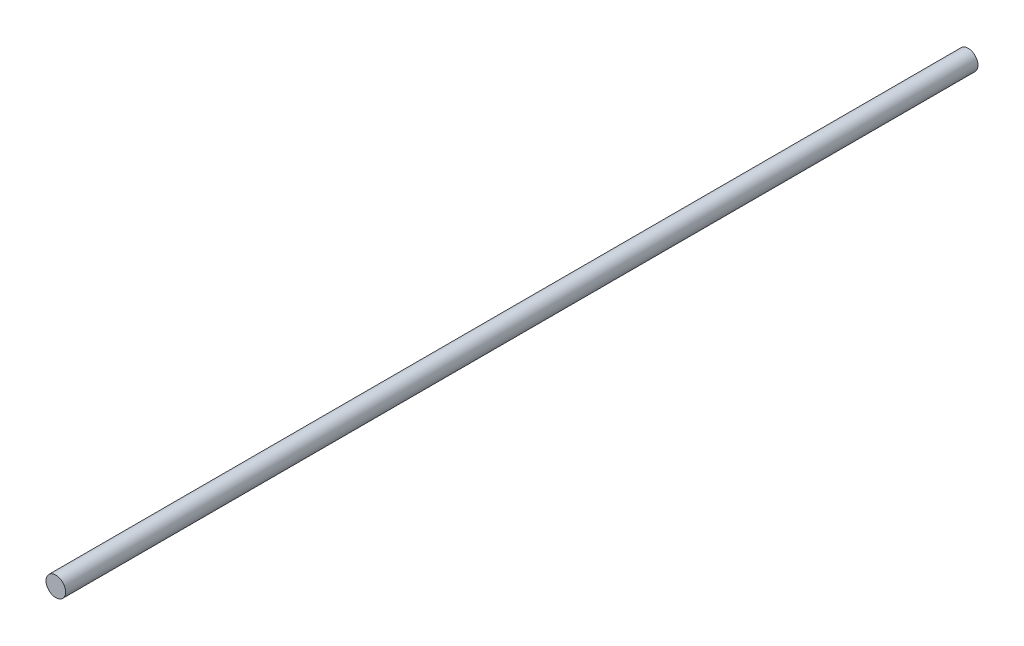
ISO-10303-21;
HEADER;
FILE_DESCRIPTION(('STEP AP214'),'2;1');
FILE_NAME('part.step','',(''),(''),'','','');
FILE_SCHEMA(('AUTOMOTIVE_DESIGN { 1 0 10303 214 1 1 1 1 }'));
ENDSEC;
DATA;
#1=APPLICATION_CONTEXT('core data for automotive mechanical design processes');
#2=APPLICATION_PROTOCOL_DEFINITION('international standard','automotive_design',2000,#1);
#3=PRODUCT_CONTEXT('',#1,'mechanical');
#4=PRODUCT('Part','Part','',(#3));
#5=PRODUCT_RELATED_PRODUCT_CATEGORY('part','',(#4));
#6=PRODUCT_DEFINITION_FORMATION('','',#4);
#7=PRODUCT_DEFINITION_CONTEXT('part definition',#1,'design');
#8=PRODUCT_DEFINITION('design','',#6,#7);
#9=PRODUCT_DEFINITION_SHAPE('','',#8);
#10=(LENGTH_UNIT() NAMED_UNIT(*) SI_UNIT(.MILLI.,.METRE.));
#11=(NAMED_UNIT(*) PLANE_ANGLE_UNIT() SI_UNIT($,.RADIAN.));
#12=(NAMED_UNIT(*) SI_UNIT($,.STERADIAN.) SOLID_ANGLE_UNIT());
#13=UNCERTAINTY_MEASURE_WITH_UNIT(LENGTH_MEASURE(1.E-05),#10,'distance_accuracy_value','');
#14=(GEOMETRIC_REPRESENTATION_CONTEXT(3) GLOBAL_UNCERTAINTY_ASSIGNED_CONTEXT((#13)) GLOBAL_UNIT_ASSIGNED_CONTEXT((#10,
#11,#12)) REPRESENTATION_CONTEXT('',''));
#15=CARTESIAN_POINT('',(0.,0.,0.));
#16=DIRECTION('',(0.,0.,1.));
#17=DIRECTION('',(1.,0.,0.));
#18=AXIS2_PLACEMENT_3D('',#15,#16,#17);
#19=CARTESIAN_POINT('',(0.,0.,590.3));
#20=DIRECTION('',(0.,0.,-1.));
#21=DIRECTION('',(-1.,0.,0.));
#22=AXIS2_PLACEMENT_3D('',#19,#20,#21);
#23=CYLINDRICAL_SURFACE('',#22,6.35);
#24=CARTESIAN_POINT('',(0.,0.,590.3));
#25=DIRECTION('',(0.,0.,1.));
#26=DIRECTION('',(1.,0.,0.));
#27=AXIS2_PLACEMENT_3D('',#24,#25,#26);
#28=CIRCLE('',#27,6.35);
#29=CARTESIAN_POINT('',(6.35,0.,590.3));
#30=VERTEX_POINT('',#29);
#31=EDGE_CURVE('E10',#30,#30,#28,.T.);
#32=ORIENTED_EDGE('',*,*,#31,.F.);
#33=EDGE_LOOP('',(#32));
#34=FACE_BOUND('',#33,.T.);
#35=CARTESIAN_POINT('',(0.,0.,0.));
#36=DIRECTION('',(0.,0.,1.));
#37=DIRECTION('',(1.,0.,0.));
#38=AXIS2_PLACEMENT_3D('',#35,#36,#37);
#39=CIRCLE('',#38,6.35);
#40=CARTESIAN_POINT('',(6.35,0.,0.));
#41=VERTEX_POINT('',#40);
#42=EDGE_CURVE('E42',#41,#41,#39,.T.);
#43=ORIENTED_EDGE('',*,*,#42,.T.);
#44=EDGE_LOOP('',(#43));
#45=FACE_BOUND('',#44,.T.);
#46=ADVANCED_FACE('F39',(#34,#45),#23,.T.);
#47=CARTESIAN_POINT('',(0.,0.,590.3));
#48=DIRECTION('',(0.,0.,1.));
#49=DIRECTION('',(1.,0.,0.));
#50=AXIS2_PLACEMENT_3D('',#47,#48,#49);
#51=PLANE('',#50);
#52=ORIENTED_EDGE('',*,*,#31,.T.);
#53=EDGE_LOOP('',(#52));
#54=FACE_BOUND('',#53,.T.);
#55=ADVANCED_FACE('F54',(#54),#51,.T.);
#56=CARTESIAN_POINT('',(0.,0.,0.));
#57=DIRECTION('',(0.,0.,1.));
#58=DIRECTION('',(1.,0.,0.));
#59=AXIS2_PLACEMENT_3D('',#56,#57,#58);
#60=PLANE('',#59);
#61=ORIENTED_EDGE('',*,*,#42,.F.);
#62=EDGE_LOOP('',(#61));
#63=FACE_BOUND('',#62,.T.);
#64=ADVANCED_FACE('F52',(#63),#60,.F.);
#65=CLOSED_SHELL('',(#46,#55,#64));
#66=MANIFOLD_SOLID_BREP('B2',#65);
#67=ADVANCED_BREP_SHAPE_REPRESENTATION('',(#18,#66),#14);
#68=SHAPE_DEFINITION_REPRESENTATION(#9,#67);
ENDSEC;
END-ISO-10303-21;
